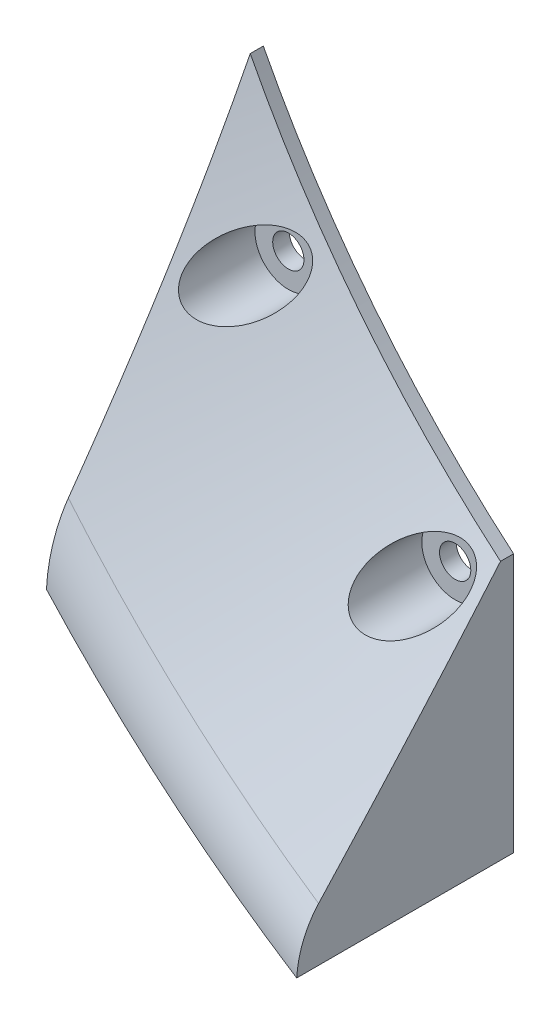
ISO-10303-21;
HEADER;
FILE_DESCRIPTION(('STEP AP214'),'2;1');
FILE_NAME('part.step','',(''),(''),'','','');
FILE_SCHEMA(('AUTOMOTIVE_DESIGN { 1 0 10303 214 1 1 1 1 }'));
ENDSEC;
DATA;
#1=APPLICATION_CONTEXT('core data for automotive mechanical design processes');
#2=APPLICATION_PROTOCOL_DEFINITION('international standard','automotive_design',2000,#1);
#3=PRODUCT_CONTEXT('',#1,'mechanical');
#4=PRODUCT('Part','Part','',(#3));
#5=PRODUCT_RELATED_PRODUCT_CATEGORY('part','',(#4));
#6=PRODUCT_DEFINITION_FORMATION('','',#4);
#7=PRODUCT_DEFINITION_CONTEXT('part definition',#1,'design');
#8=PRODUCT_DEFINITION('design','',#6,#7);
#9=PRODUCT_DEFINITION_SHAPE('','',#8);
#10=(LENGTH_UNIT() NAMED_UNIT(*) SI_UNIT(.MILLI.,.METRE.));
#11=(NAMED_UNIT(*) PLANE_ANGLE_UNIT() SI_UNIT($,.RADIAN.));
#12=(NAMED_UNIT(*) SI_UNIT($,.STERADIAN.) SOLID_ANGLE_UNIT());
#13=UNCERTAINTY_MEASURE_WITH_UNIT(LENGTH_MEASURE(1.E-05),#10,'distance_accuracy_value','');
#14=(GEOMETRIC_REPRESENTATION_CONTEXT(3) GLOBAL_UNCERTAINTY_ASSIGNED_CONTEXT((#13)) GLOBAL_UNIT_ASSIGNED_CONTEXT((#10,
#11,#12)) REPRESENTATION_CONTEXT('',''));
#15=CARTESIAN_POINT('',(0.,0.,0.));
#16=DIRECTION('',(0.,0.,1.));
#17=DIRECTION('',(1.,0.,0.));
#18=AXIS2_PLACEMENT_3D('',#15,#16,#17);
#19=CARTESIAN_POINT('',(-140.965544713,0.,3.175));
#20=DIRECTION('',(1.,0.,0.));
#21=DIRECTION('',(0.,0.,-1.));
#22=AXIS2_PLACEMENT_3D('',#19,#20,#21);
#23=PLANE('',#22);
#24=DIRECTION('',(0.,0.,-1.));
#25=VECTOR('',#24,1.);
#26=CARTESIAN_POINT('',(-140.965544713,-128.136510034288,36.195));
#27=LINE('',#26,#25);
#28=CARTESIAN_POINT('',(-140.965544713,-128.136510034288,36.195));
#29=VERTEX_POINT('',#28);
#30=CARTESIAN_POINT('',(-140.965544713,-128.136510034288,3.175));
#31=VERTEX_POINT('',#30);
#32=EDGE_CURVE('E137',#29,#31,#27,.T.);
#33=ORIENTED_EDGE('',*,*,#32,.F.);
#34=CARTESIAN_POINT('',(-140.965544713,-128.136510034288,36.195));
#35=CARTESIAN_POINT('',(-140.965544713,-127.823580349849,36.1796656996604));
#36=CARTESIAN_POINT('',(-140.965544713,-127.510971987033,36.1578071405204));
#37=CARTESIAN_POINT('',(-140.965544713,-126.886924794625,36.1010465623842));
#38=CARTESIAN_POINT('',(-140.965544713,-126.575486029674,36.0661438328688));
#39=CARTESIAN_POINT('',(-140.965544713,-125.9537996422,35.9832296915999));
#40=CARTESIAN_POINT('',(-140.965544713,-125.643555028566,35.9351956141636));
#41=CARTESIAN_POINT('',(-140.965544713,-125.025416067989,35.8259748325979));
#42=CARTESIAN_POINT('',(-140.965544713,-124.717521692796,35.7647882868191));
#43=CARTESIAN_POINT('',(-140.965544713,-123.814718625966,35.5649447435988));
#44=CARTESIAN_POINT('',(-140.965544713,-123.223773655474,35.4077496997964));
#45=CARTESIAN_POINT('',(-140.965544713,-122.05879493956,35.0414120669158));
#46=CARTESIAN_POINT('',(-140.965544713,-121.48474633384,34.8323167498205));
#47=CARTESIAN_POINT('',(-140.965544713,-120.371871269923,34.3641787371624));
#48=CARTESIAN_POINT('',(-140.965544713,-119.832547293404,34.1063388877265));
#49=CARTESIAN_POINT('',(-140.965544713,-119.043408380623,33.6752720243169));
#50=CARTESIAN_POINT('',(-140.965544713,-118.782022278019,33.5230508447224));
#51=CARTESIAN_POINT('',(-140.965544713,-118.268546544607,33.2032771525242));
#52=CARTESIAN_POINT('',(-140.965544713,-118.016464041156,33.0357132146166));
#53=CARTESIAN_POINT('',(-140.965544713,-117.769882618231,32.8601815378478));
#54=B_SPLINE_CURVE_WITH_KNOTS('',3,(#34,#35,#36,#37,#38,#39,#40,#41,#42,#43,#44,#45,#46,#47,#48,
#49,#50,#51,#52,#53),.UNSPECIFIED.,.F.,.F.,(4,2,2,2,2,2,2,2,2,4),(0.,0.939843409882723,
1.87973802073256,2.82126531601604,3.76278127629976,5.59477906008722,7.42511430144152,
9.21509548376389,10.1220648596623,11.0297152089648),.UNSPECIFIED.);
#55=CARTESIAN_POINT('',(-140.965544713,-117.769882618231,32.8601815378473));
#56=VERTEX_POINT('',#55);
#57=EDGE_CURVE('E79',#29,#56,#54,.T.);
#58=ORIENTED_EDGE('',*,*,#57,.T.);
#59=CARTESIAN_POINT('',(-140.965544713,-122.400454671408,36.195));
#60=CARTESIAN_POINT('',(-140.965544713,-121.416590849687,35.4785968685116));
#61=CARTESIAN_POINT('',(-140.965544713,-120.430388900259,34.76540874244));
#62=CARTESIAN_POINT('',(-140.965544713,-118.453117212918,33.3457993893004));
#63=CARTESIAN_POINT('',(-140.965544713,-117.462047442748,32.6393782071672));
#64=CARTESIAN_POINT('',(-140.965544713,-114.48118501242,30.5307253962073));
#65=CARTESIAN_POINT('',(-140.965544713,-112.483822098221,29.1391649220652));
#66=CARTESIAN_POINT('',(-140.965544713,-108.47048503121,26.3897295277692));
#67=CARTESIAN_POINT('',(-140.965544713,-106.454543729004,25.031806684119));
#68=CARTESIAN_POINT('',(-140.965544713,-102.399473321646,22.3509979809147));
#69=CARTESIAN_POINT('',(-140.965544713,-100.36034425642,21.0281120610459));
#70=CARTESIAN_POINT('',(-140.965544713,-96.2563588364718,18.4208440314967));
#71=CARTESIAN_POINT('',(-140.965544713,-94.1914918681593,17.1364786038629));
#72=CARTESIAN_POINT('',(-140.965544713,-90.0352609181289,14.6114798516549));
#73=CARTESIAN_POINT('',(-140.965544713,-87.9438978934333,13.3708449536465));
#74=CARTESIAN_POINT('',(-140.965544713,-83.7297219329408,10.9366392217588));
#75=CARTESIAN_POINT('',(-140.965544713,-81.6068668523711,9.7431411216564));
#76=CARTESIAN_POINT('',(-140.965544713,-78.3999695866644,7.99408029022117));
#77=CARTESIAN_POINT('',(-140.965544713,-77.3271526736967,7.41788235005025));
#78=CARTESIAN_POINT('',(-140.965544713,-75.1737936033442,6.280052268688));
#79=CARTESIAN_POINT('',(-140.965544713,-74.0932512736997,5.71842045358934));
#80=CARTESIAN_POINT('',(-140.965544713,-73.0087508711607,5.16448633567178));
#81=B_SPLINE_CURVE_WITH_KNOTS('',3,(#59,#60,#61,#62,#63,#64,#65,#66,#67,#68,#69,#70,#71,#72,#73,
#74,#75,#76,#77,#78,#79,#80),.UNSPECIFIED.,.F.,.F.,(4,2,2,2,2,2,2,2,2,2,4),(0.,3.65115060245099,
7.3023254330328,14.6049827275261,21.8965557206125,29.1881161606817,36.4827900453566,
43.7772011975581,51.0824600388428,54.7356424704663,58.3889066156202),.UNSPECIFIED.);
#82=CARTESIAN_POINT('',(-140.965544713,-73.0087508711607,5.16448633567178));
#83=VERTEX_POINT('',#82);
#84=EDGE_CURVE('E104',#56,#83,#81,.T.);
#85=ORIENTED_EDGE('',*,*,#84,.T.);
#86=DIRECTION('',(0.,0.,-1.));
#87=VECTOR('',#86,1.);
#88=CARTESIAN_POINT('',(-140.965544713,-73.0087508711607,36.195));
#89=LINE('',#88,#87);
#90=CARTESIAN_POINT('',(-140.965544713,-73.0087508711607,3.175));
#91=VERTEX_POINT('',#90);
#92=EDGE_CURVE('E100',#83,#91,#89,.T.);
#93=ORIENTED_EDGE('',*,*,#92,.T.);
#94=DIRECTION('',(0.,-1.,0.));
#95=VECTOR('',#94,1.);
#96=CARTESIAN_POINT('',(-140.965544713,0.,3.175));
#97=LINE('',#96,#95);
#98=EDGE_CURVE('E102',#91,#31,#97,.T.);
#99=ORIENTED_EDGE('',*,*,#98,.T.);
#100=EDGE_LOOP('',(#33,#58,#85,#93,#99));
#101=FACE_BOUND('',#100,.T.);
#102=ADVANCED_FACE('F51',(#101),#23,.F.);
#103=CARTESIAN_POINT('',(-102.865544713,0.,3.175));
#104=DIRECTION('',(1.,0.,0.));
#105=DIRECTION('',(0.,0.,-1.));
#106=AXIS2_PLACEMENT_3D('',#103,#104,#105);
#107=PLANE('',#106);
#108=CARTESIAN_POINT('',(-102.865544713,-120.914193587427,5.16448633567178));
#109=CARTESIAN_POINT('',(-102.865544713,-122.399563837253,6.42100901924889));
#110=CARTESIAN_POINT('',(-102.865544713,-123.880160902784,7.68316059880523));
#111=CARTESIAN_POINT('',(-102.865544713,-126.832432831344,10.2178324006914));
#112=CARTESIAN_POINT('',(-102.865544713,-128.304107770391,11.4903525344618));
#113=CARTESIAN_POINT('',(-102.865544713,-131.239001679849,14.0447342694597));
#114=CARTESIAN_POINT('',(-102.865544713,-132.702221683243,15.3265946843371));
#115=CARTESIAN_POINT('',(-102.865544713,-135.62095552979,17.8990597877047));
#116=CARTESIAN_POINT('',(-102.865544713,-137.07646935619,19.1896644951896));
#117=CARTESIAN_POINT('',(-102.865544713,-141.432155458038,23.0734602819268));
#118=CARTESIAN_POINT('',(-102.865544713,-144.32157637017,25.6787237219854));
#119=CARTESIAN_POINT('',(-102.865544713,-148.63709536136,29.607381891577));
#120=CARTESIAN_POINT('',(-102.865544713,-150.072592689782,30.9204814755747));
#121=CARTESIAN_POINT('',(-102.865544713,-152.937709400675,33.553067705367));
#122=CARTESIAN_POINT('',(-102.865544713,-154.367328805098,34.8725543272694));
#123=CARTESIAN_POINT('',(-102.865544713,-155.794209811847,36.195));
#124=B_SPLINE_CURVE_WITH_KNOTS('',3,(#108,#109,#110,#111,#112,#113,#114,#115,#116,#117,#118,
#119,#120,#121,#122,#123),.UNSPECIFIED.,.F.,.F.,(4,2,2,2,2,2,2,4),(0.,5.83663014040787,
11.6732104813489,17.509061984713,23.3449261690225,35.0162405528466,40.8526594638885,
46.6890565592332),.UNSPECIFIED.);
#125=CARTESIAN_POINT('',(-102.865544713,-120.914193587427,5.16448633567178));
#126=VERTEX_POINT('',#125);
#127=CARTESIAN_POINT('',(-102.865544713,-152.183145449951,32.8601815378427));
#128=VERTEX_POINT('',#127);
#129=EDGE_CURVE('E128',#126,#128,#124,.T.);
#130=ORIENTED_EDGE('',*,*,#129,.T.);
#131=CARTESIAN_POINT('',(-102.865544713,-152.183145449951,32.8601815378427));
#132=CARTESIAN_POINT('',(-102.865544713,-152.443121718155,33.0993914461446));
#133=CARTESIAN_POINT('',(-102.865544713,-152.714270381032,33.3262228842414));
#134=CARTESIAN_POINT('',(-102.865544713,-153.275554277137,33.7545493000897));
#135=CARTESIAN_POINT('',(-102.865544713,-153.565673176992,33.9560656485142));
#136=CARTESIAN_POINT('',(-102.865544713,-154.161490290658,34.3332727800575));
#137=CARTESIAN_POINT('',(-102.865544713,-154.46716147505,34.5090064380888));
#138=CARTESIAN_POINT('',(-102.865544713,-155.091846918515,34.8349149125472));
#139=CARTESIAN_POINT('',(-102.865544713,-155.410862389247,34.9850874017217));
#140=CARTESIAN_POINT('',(-102.865544713,-156.058624801755,35.2593065570738));
#141=CARTESIAN_POINT('',(-102.865544713,-156.387334980607,35.3834402899615));
#142=CARTESIAN_POINT('',(-102.865544713,-157.053285929378,35.6061906027648));
#143=CARTESIAN_POINT('',(-102.865544713,-157.390526937879,35.7048064681522));
#144=CARTESIAN_POINT('',(-102.865544713,-158.070962609656,35.8763613762573));
#145=CARTESIAN_POINT('',(-102.865544713,-158.414148391961,35.9493357488788));
#146=CARTESIAN_POINT('',(-102.865544713,-159.104970758979,36.0697426777758));
#147=CARTESIAN_POINT('',(-102.865544713,-159.45260708813,36.1171766939584));
#148=CARTESIAN_POINT('',(-102.865544713,-159.98071516167,36.1695822058618));
#149=CARTESIAN_POINT('',(-102.865544713,-160.160286783164,36.183986081665));
#150=CARTESIAN_POINT('',(-102.865544713,-160.340044003043,36.1950000000002));
#151=B_SPLINE_CURVE_WITH_KNOTS('',3,(#131,#132,#133,#134,#135,#136,#137,#138,#139,#140,#141,
#142,#143,#144,#145,#146,#147,#148,#149,#150),.UNSPECIFIED.,.F.,.F.,(4,2,2,2,2,2,2,2,2,4),(0.,
1.05922674855689,2.11755321519276,3.17409930626109,4.23074154065711,5.28379224764771,
6.3368724380152,7.38849590842379,8.44005926081059,8.98036703986255),.UNSPECIFIED.);
#152=CARTESIAN_POINT('',(-102.865544713,-160.340044003043,36.195));
#153=VERTEX_POINT('',#152);
#154=EDGE_CURVE('E13',#128,#153,#151,.T.);
#155=ORIENTED_EDGE('',*,*,#154,.T.);
#156=DIRECTION('',(0.,0.,-1.));
#157=VECTOR('',#156,1.);
#158=CARTESIAN_POINT('',(-102.865544713,-160.340044003043,36.195));
#159=LINE('',#158,#157);
#160=CARTESIAN_POINT('',(-102.865544713,-160.340044003043,3.175));
#161=VERTEX_POINT('',#160);
#162=EDGE_CURVE('E119',#153,#161,#159,.T.);
#163=ORIENTED_EDGE('',*,*,#162,.T.);
#164=DIRECTION('',(0.,-1.,0.));
#165=VECTOR('',#164,1.);
#166=CARTESIAN_POINT('',(-102.865544713,0.,3.175));
#167=LINE('',#166,#165);
#168=CARTESIAN_POINT('',(-102.865544713,-120.914193587427,3.175));
#169=VERTEX_POINT('',#168);
#170=EDGE_CURVE('E134',#169,#161,#167,.T.);
#171=ORIENTED_EDGE('',*,*,#170,.F.);
#172=DIRECTION('',(0.,0.,-1.));
#173=VECTOR('',#172,1.);
#174=CARTESIAN_POINT('',(-102.865544713,-120.914193587427,36.195));
#175=LINE('',#174,#173);
#176=EDGE_CURVE('E123',#126,#169,#175,.T.);
#177=ORIENTED_EDGE('',*,*,#176,.F.);
#178=EDGE_LOOP('',(#130,#155,#163,#171,#177));
#179=FACE_BOUND('',#178,.T.);
#180=ADVANCED_FACE('F155',(#179),#107,.T.);
#181=CARTESIAN_POINT('',(-134.615544713,-95.5859044086643,0.));
#182=DIRECTION('',(0.,0.,1.));
#183=DIRECTION('',(1.,0.,0.));
#184=AXIS2_PLACEMENT_3D('',#181,#182,#183);
#185=CYLINDRICAL_SURFACE('',#184,2.38125);
#186=CARTESIAN_POINT('',(-134.615544713,-95.5859044086643,5.715));
#187=DIRECTION('',(0.,0.,-1.));
#188=DIRECTION('',(-1.,0.,0.));
#189=AXIS2_PLACEMENT_3D('',#186,#187,#188);
#190=CIRCLE('',#189,2.38125);
#191=CARTESIAN_POINT('',(-136.996794713,-95.5859044086643,5.715));
#192=VERTEX_POINT('',#191);
#193=EDGE_CURVE('E109',#192,#192,#190,.F.);
#194=ORIENTED_EDGE('',*,*,#193,.T.);
#195=EDGE_LOOP('',(#194));
#196=FACE_BOUND('',#195,.T.);
#197=CARTESIAN_POINT('',(-134.615544713,-95.5859044086643,3.175));
#198=DIRECTION('',(0.,0.,1.));
#199=DIRECTION('',(1.,0.,0.));
#200=AXIS2_PLACEMENT_3D('',#197,#198,#199);
#201=CIRCLE('',#200,2.38125);
#202=CARTESIAN_POINT('',(-132.234294713,-95.5859044086643,3.175));
#203=VERTEX_POINT('',#202);
#204=EDGE_CURVE('E139',#203,#203,#201,.F.);
#205=ORIENTED_EDGE('',*,*,#204,.T.);
#206=EDGE_LOOP('',(#205));
#207=FACE_BOUND('',#206,.T.);
#208=ADVANCED_FACE('F199',(#196,#207),#185,.F.);
#209=CARTESIAN_POINT('',(-109.215544713,-123.814275400871,0.));
#210=DIRECTION('',(0.,0.,1.));
#211=DIRECTION('',(1.,0.,0.));
#212=AXIS2_PLACEMENT_3D('',#209,#210,#211);
#213=CYLINDRICAL_SURFACE('',#212,2.38125);
#214=CARTESIAN_POINT('',(-109.215544713,-123.814275400871,5.715));
#215=DIRECTION('',(0.,0.,-1.));
#216=DIRECTION('',(-1.,0.,0.));
#217=AXIS2_PLACEMENT_3D('',#214,#215,#216);
#218=CIRCLE('',#217,2.38125);
#219=CARTESIAN_POINT('',(-111.596794713,-123.814275400871,5.715));
#220=VERTEX_POINT('',#219);
#221=EDGE_CURVE('E224',#220,#220,#218,.F.);
#222=ORIENTED_EDGE('',*,*,#221,.T.);
#223=EDGE_LOOP('',(#222));
#224=FACE_BOUND('',#223,.T.);
#225=CARTESIAN_POINT('',(-109.215544713,-123.814275400871,3.175));
#226=DIRECTION('',(0.,0.,1.));
#227=DIRECTION('',(1.,0.,0.));
#228=AXIS2_PLACEMENT_3D('',#225,#226,#227);
#229=CIRCLE('',#228,2.38125);
#230=CARTESIAN_POINT('',(-106.834294713,-123.814275400871,3.175));
#231=VERTEX_POINT('',#230);
#232=EDGE_CURVE('E136',#231,#231,#229,.F.);
#233=ORIENTED_EDGE('',*,*,#232,.T.);
#234=EDGE_LOOP('',(#233));
#235=FACE_BOUND('',#234,.T.);
#236=ADVANCED_FACE('F197',(#224,#235),#213,.F.);
#237=CARTESIAN_POINT('',(0.,0.,3.175));
#238=DIRECTION('',(0.,0.,1.));
#239=DIRECTION('',(1.,0.,0.));
#240=AXIS2_PLACEMENT_3D('',#237,#238,#239);
#241=PLANE('',#240);
#242=CARTESIAN_POINT('',(0.,0.,3.175));
#243=DIRECTION('',(0.,0.,1.));
#244=DIRECTION('',(1.,0.,0.));
#245=AXIS2_PLACEMENT_3D('',#242,#243,#244);
#246=CIRCLE('',#245,190.5);
#247=EDGE_CURVE('E117',#31,#161,#246,.T.);
#248=ORIENTED_EDGE('',*,*,#247,.F.);
#249=ORIENTED_EDGE('',*,*,#98,.F.);
#250=CARTESIAN_POINT('',(0.,0.,3.175));
#251=DIRECTION('',(0.,0.,1.));
#252=DIRECTION('',(1.,0.,0.));
#253=AXIS2_PLACEMENT_3D('',#250,#251,#252);
#254=CIRCLE('',#253,158.75);
#255=EDGE_CURVE('E115',#91,#169,#254,.T.);
#256=ORIENTED_EDGE('',*,*,#255,.T.);
#257=ORIENTED_EDGE('',*,*,#170,.T.);
#258=EDGE_LOOP('',(#248,#249,#256,#257));
#259=FACE_BOUND('',#258,.T.);
#260=ORIENTED_EDGE('',*,*,#232,.F.);
#261=EDGE_LOOP('',(#260));
#262=FACE_BOUND('',#261,.T.);
#263=ORIENTED_EDGE('',*,*,#204,.F.);
#264=EDGE_LOOP('',(#263));
#265=FACE_BOUND('',#264,.T.);
#266=ADVANCED_FACE('F113',(#259,#262,#265),#241,.F.);
#267=CARTESIAN_POINT('',(0.,0.,36.195));
#268=DIRECTION('',(0.,0.,-1.));
#269=DIRECTION('',(-1.,0.,0.));
#270=AXIS2_PLACEMENT_3D('',#267,#268,#269);
#271=CYLINDRICAL_SURFACE('',#270,190.5);
#272=ORIENTED_EDGE('',*,*,#247,.T.);
#273=ORIENTED_EDGE('',*,*,#162,.F.);
#274=CARTESIAN_POINT('',(0.,0.,36.195));
#275=DIRECTION('',(0.,0.,1.));
#276=DIRECTION('',(1.,0.,0.));
#277=AXIS2_PLACEMENT_3D('',#274,#275,#276);
#278=CIRCLE('',#277,190.5);
#279=EDGE_CURVE('E126',#29,#153,#278,.T.);
#280=ORIENTED_EDGE('',*,*,#279,.F.);
#281=ORIENTED_EDGE('',*,*,#32,.T.);
#282=EDGE_LOOP('',(#272,#273,#280,#281));
#283=FACE_BOUND('',#282,.T.);
#284=ADVANCED_FACE('F216',(#283),#271,.T.);
#285=CARTESIAN_POINT('',(0.,0.,36.195));
#286=DIRECTION('',(0.,0.,-1.));
#287=DIRECTION('',(-1.,0.,0.));
#288=AXIS2_PLACEMENT_3D('',#285,#286,#287);
#289=CYLINDRICAL_SURFACE('',#288,158.75);
#290=ORIENTED_EDGE('',*,*,#92,.F.);
#291=CARTESIAN_POINT('',(0.,0.,5.16448633567178));
#292=DIRECTION('',(0.,0.,1.));
#293=DIRECTION('',(1.,0.,0.));
#294=AXIS2_PLACEMENT_3D('',#291,#292,#293);
#295=CIRCLE('',#294,158.75);
#296=EDGE_CURVE('E125',#83,#126,#295,.T.);
#297=ORIENTED_EDGE('',*,*,#296,.T.);
#298=ORIENTED_EDGE('',*,*,#176,.T.);
#299=ORIENTED_EDGE('',*,*,#255,.F.);
#300=EDGE_LOOP('',(#290,#297,#298,#299));
#301=FACE_BOUND('',#300,.T.);
#302=ADVANCED_FACE('F121',(#301),#289,.F.);
#303=CARTESIAN_POINT('',(0.,0.,5.16448633567178));
#304=DIRECTION('',(0.,0.,1.));
#305=DIRECTION('',(1.,0.,0.));
#306=AXIS2_PLACEMENT_3D('',#303,#304,#305);
#307=CONICAL_SURFACE('',#306,158.75,0.733038285837613);
#308=CARTESIAN_POINT('',(-113.140586966999,-127.039247230876,17.7887178190615));
#309=CARTESIAN_POINT('',(-113.076390315873,-127.11738039782,17.8061015104382));
#310=CARTESIAN_POINT('',(-113.009518090225,-127.194005570302,17.8203561981865));
#311=CARTESIAN_POINT('',(-112.870758813036,-127.343612167539,17.8423442933654));
#312=CARTESIAN_POINT('',(-112.798870499912,-127.416592667658,17.8500760537861));
#313=CARTESIAN_POINT('',(-112.650562829045,-127.558280265856,17.8588567655701));
#314=CARTESIAN_POINT('',(-112.574141848034,-127.626985814693,17.859903308018));
#315=CARTESIAN_POINT('',(-112.4173609923,-127.759565749781,17.8552852893378));
#316=CARTESIAN_POINT('',(-112.336999599818,-127.823438249972,17.8496181224601));
#317=CARTESIAN_POINT('',(-112.173243563226,-127.945720016927,17.831705659719));
#318=CARTESIAN_POINT('',(-112.089856980553,-128.004142506699,17.8194767985287));
#319=CARTESIAN_POINT('',(-111.92052943578,-128.115406180831,17.7886831431106));
#320=CARTESIAN_POINT('',(-111.834587494397,-128.168245189183,17.770115890508));
#321=CARTESIAN_POINT('',(-111.660864408019,-128.268133534975,17.7269815073936));
#322=CARTESIAN_POINT('',(-111.573083125788,-128.315182438599,17.7024139277266));
#323=CARTESIAN_POINT('',(-111.396326247801,-128.403431732317,17.6476845160489));
#324=CARTESIAN_POINT('',(-111.307350409542,-128.444630914614,17.6175215317062));
#325=CARTESIAN_POINT('',(-111.106927829961,-128.530596831443,17.5440259651274));
#326=CARTESIAN_POINT('',(-110.995312742537,-128.573767585892,17.4992770794999));
#327=CARTESIAN_POINT('',(-110.772130697494,-128.651362913875,17.4026941886754));
#328=CARTESIAN_POINT('',(-110.66056375641,-128.685785512373,17.3508585875962));
#329=CARTESIAN_POINT('',(-110.326916638053,-128.776571152282,17.1859166525368));
#330=CARTESIAN_POINT('',(-110.106005774244,-128.820403901592,17.0634187224647));
#331=CARTESIAN_POINT('',(-109.58783700381,-128.889730781329,16.7485647750944));
#332=CARTESIAN_POINT('',(-109.294104985017,-128.901570484311,16.5475165368222));
#333=CARTESIAN_POINT('',(-108.86897346313,-128.884429292071,16.2280782326074));
#334=CARTESIAN_POINT('',(-108.729670549546,-128.872861111811,16.1184677221754));
#335=CARTESIAN_POINT('',(-108.456422181706,-128.839120813814,15.8942485653298));
#336=CARTESIAN_POINT('',(-108.322476768947,-128.816948613957,15.7796398802156));
#337=CARTESIAN_POINT('',(-108.002550679183,-128.751098223893,15.4950973422487));
#338=CARTESIAN_POINT('',(-107.819571266756,-128.702251005113,15.3229844231208));
#339=CARTESIAN_POINT('',(-107.465537902478,-128.586962725597,14.972462926533));
#340=CARTESIAN_POINT('',(-107.294489126722,-128.520514087749,14.7940516664811));
#341=CARTESIAN_POINT('',(-106.964442393956,-128.371874926291,14.4324976689105));
#342=CARTESIAN_POINT('',(-106.805452857004,-128.28967354241,14.2493517430152));
#343=CARTESIAN_POINT('',(-106.499821695643,-128.111084614674,13.8797893209877));
#344=CARTESIAN_POINT('',(-106.353178566457,-128.01469880356,13.6933732267792));
#345=CARTESIAN_POINT('',(-106.067878428309,-127.80562478509,13.3123117388358));
#346=CARTESIAN_POINT('',(-105.929629112499,-127.692512450487,13.1175943203596));
#347=CARTESIAN_POINT('',(-105.666717166591,-127.453477151525,12.7268510746178));
#348=CARTESIAN_POINT('',(-105.542055321659,-127.327553447662,12.5308251724343));
#349=CARTESIAN_POINT('',(-105.306710767366,-127.063687115915,12.1384026626774));
#350=CARTESIAN_POINT('',(-105.196030870695,-126.925742079152,11.9420059885568));
#351=CARTESIAN_POINT('',(-104.989259965623,-126.638497866944,11.5498456510513));
#352=CARTESIAN_POINT('',(-104.893168347585,-126.489199166354,11.354081961549));
#353=CARTESIAN_POINT('',(-104.715645465079,-126.178503852977,10.9626265988547));
#354=CARTESIAN_POINT('',(-104.63433758184,-126.017020042858,10.766948020491));
#355=CARTESIAN_POINT('',(-104.488397056295,-125.683401476994,10.3783770230577));
#356=CARTESIAN_POINT('',(-104.423767092489,-125.511265015915,10.1854850562121));
#357=CARTESIAN_POINT('',(-104.312674978481,-125.15692600972,9.80412135998445));
#358=CARTESIAN_POINT('',(-104.266193190243,-124.974734590134,9.61564506126811));
#359=CARTESIAN_POINT('',(-104.193147299341,-124.60056302436,9.24469893467824));
#360=CARTESIAN_POINT('',(-104.166573387411,-124.40858774887,9.06222619108834));
#361=CARTESIAN_POINT('',(-104.141220382312,-124.085687081535,8.76933618015192));
#362=CARTESIAN_POINT('',(-104.135900565051,-123.957475363168,8.65648281768621));
#363=CARTESIAN_POINT('',(-104.135223099943,-123.697452302531,8.4349806756223));
#364=CARTESIAN_POINT('',(-104.139867054039,-123.565640384798,8.326332574991));
#365=CARTESIAN_POINT('',(-104.17005078967,-123.16552045803,8.00832029168472));
#366=CARTESIAN_POINT('',(-104.21179356449,-122.891996178434,7.80639996191763));
#367=CARTESIAN_POINT('',(-104.329918771818,-122.406111854473,7.48032423245789));
#368=CARTESIAN_POINT('',(-104.395007782082,-122.195589541588,7.3493579295817));
#369=CARTESIAN_POINT('',(-104.557938752848,-121.773670652553,7.11117175586325));
#370=CARTESIAN_POINT('',(-104.655732978925,-121.562275791478,7.003917653008));
#371=CARTESIAN_POINT('',(-104.863589631382,-121.18689499686,6.83921220646396));
#372=CARTESIAN_POINT('',(-104.967246021531,-121.021912530993,6.77608509386644));
#373=CARTESIAN_POINT('',(-105.139481168932,-120.780811235291,6.69951983513149));
#374=CARTESIAN_POINT('',(-105.19969694184,-120.70149255677,6.67701657571878));
#375=CARTESIAN_POINT('',(-105.325513429326,-120.545626087158,6.63846379467833));
#376=CARTESIAN_POINT('',(-105.391111901059,-120.469077160943,6.6224116013199));
#377=CARTESIAN_POINT('',(-105.527745463243,-120.31900802809,6.59702703452759));
#378=CARTESIAN_POINT('',(-105.598808980202,-120.245507214774,6.58773285214586));
#379=CARTESIAN_POINT('',(-105.745518939006,-120.102699409142,6.57622160369489));
#380=CARTESIAN_POINT('',(-105.821163491948,-120.033390711533,6.57400164068308));
#381=CARTESIAN_POINT('',(-105.976459868918,-119.899529644222,6.57668667954218));
#382=CARTESIAN_POINT('',(-106.056112414079,-119.834978135638,6.58159296805272));
#383=CARTESIAN_POINT('',(-106.21867409863,-119.711151343348,6.59840643227028));
#384=CARTESIAN_POINT('',(-106.301583137189,-119.65187589646,6.61031339137008));
#385=CARTESIAN_POINT('',(-106.540999415747,-119.491311282885,6.6538024895316));
#386=CARTESIAN_POINT('',(-106.70063799021,-119.39672221954,6.69350918055355));
#387=CARTESIAN_POINT('',(-107.023960721251,-119.227688131059,6.79323937307681));
#388=CARTESIAN_POINT('',(-107.187646451854,-119.153251082363,6.85327089832455));
#389=CARTESIAN_POINT('',(-107.581195174189,-118.998038809066,7.01788342203895));
#390=CARTESIAN_POINT('',(-107.811326581218,-118.926648732332,7.13067847838025));
#391=CARTESIAN_POINT('',(-108.266067224069,-118.818293516656,7.38130155358936));
#392=CARTESIAN_POINT('',(-108.490663402482,-118.781403366094,7.51918332758338));
#393=CARTESIAN_POINT('',(-108.868878279669,-118.743622083132,7.77185521356254));
#394=CARTESIAN_POINT('',(-109.024781511631,-118.735548795046,7.88232001342649));
#395=CARTESIAN_POINT('',(-109.33115491127,-118.733279961618,8.11077579873637));
#396=CARTESIAN_POINT('',(-109.481622727555,-118.739090351146,8.22876998179223));
#397=CARTESIAN_POINT('',(-109.776833030452,-118.763204232285,8.47084556459911));
#398=CARTESIAN_POINT('',(-109.921567235139,-118.781525145087,8.59493522853087));
#399=CARTESIAN_POINT('',(-110.204864869405,-118.82947040586,8.84782312489465));
#400=CARTESIAN_POINT('',(-110.343428384754,-118.859094596666,8.97662129183519));
#401=CARTESIAN_POINT('',(-110.674409085893,-118.944070825663,9.29597839132338));
#402=CARTESIAN_POINT('',(-110.863436981019,-119.005006162067,9.48858016123775));
#403=CARTESIAN_POINT('',(-111.228233765604,-119.145900185466,9.8793370938676));
#404=CARTESIAN_POINT('',(-111.403996915455,-119.225867045877,10.0774946102485));
#405=CARTESIAN_POINT('',(-111.742171264376,-119.403037520644,10.4777417892231));
#406=CARTESIAN_POINT('',(-111.904571224761,-119.500255430895,10.6798345883567));
#407=CARTESIAN_POINT('',(-112.215575388584,-119.710443606866,11.0863440868811));
#408=CARTESIAN_POINT('',(-112.364181433658,-119.823411764705,11.2907604719459));
#409=CARTESIAN_POINT('',(-112.651050457004,-120.067265108108,11.7062546234733));
#410=CARTESIAN_POINT('',(-112.788927714348,-120.198550490753,11.9173636729047));
#411=CARTESIAN_POINT('',(-113.049157588357,-120.475720184138,12.3396047955641));
#412=CARTESIAN_POINT('',(-113.171508605866,-120.621605995914,12.5507368689258));
#413=CARTESIAN_POINT('',(-113.399759282327,-120.927216636812,12.9717180739997));
#414=CARTESIAN_POINT('',(-113.505666063605,-121.086935427637,13.1815677231094));
#415=CARTESIAN_POINT('',(-113.69991628387,-121.419713972098,13.5987772615913));
#416=CARTESIAN_POINT('',(-113.788263298855,-121.592770999455,13.806137649796));
#417=CARTESIAN_POINT('',(-113.931680624795,-121.919467197334,14.1799465013823));
#418=CARTESIAN_POINT('',(-113.989878220293,-122.070996825346,14.3470424368463));
#419=CARTESIAN_POINT('',(-114.092359560558,-122.382505089657,14.677646188619));
#420=CARTESIAN_POINT('',(-114.136642651981,-122.542484122278,14.8411538361074));
#421=CARTESIAN_POINT('',(-114.209911216409,-122.870403137607,15.1632102240033));
#422=CARTESIAN_POINT('',(-114.238914728231,-123.038333476587,15.3217646030864));
#423=CARTESIAN_POINT('',(-114.280058102995,-123.381826491086,15.6325568970638));
#424=CARTESIAN_POINT('',(-114.292204599656,-123.55738613619,15.7847972738048));
#425=CARTESIAN_POINT('',(-114.298723384778,-123.982789189361,16.1367653824529));
#426=CARTESIAN_POINT('',(-114.284737153336,-124.235832712287,16.3329290182894));
#427=CARTESIAN_POINT('',(-114.214978125778,-124.752267148071,16.7031256956984));
#428=CARTESIAN_POINT('',(-114.159255040327,-125.015645398404,16.8771847766807));
#429=CARTESIAN_POINT('',(-114.019065395651,-125.480311259046,17.1539320868535));
#430=CARTESIAN_POINT('',(-113.945318998887,-125.680596781037,17.2635699303579));
#431=CARTESIAN_POINT('',(-113.812387346098,-125.979294581189,17.4105646494451));
#432=CARTESIAN_POINT('',(-113.764406863927,-126.078490995751,17.4566217382474));
#433=CARTESIAN_POINT('',(-113.660808245722,-126.275660635477,17.5422624015761));
#434=CARTESIAN_POINT('',(-113.605193531984,-126.373634387389,17.5818488594525));
#435=CARTESIAN_POINT('',(-113.485923275877,-126.568062953143,17.6540339023377));
#436=CARTESIAN_POINT('',(-113.422225462053,-126.6645065436,17.6865931269762));
#437=CARTESIAN_POINT('',(-113.287103769617,-126.854404664638,17.7437707368517));
#438=CARTESIAN_POINT('',(-113.21567562053,-126.947857505725,17.7683847026763));
#439=CARTESIAN_POINT('',(-113.140586966999,-127.039247230876,17.7887178190615));
#440=B_SPLINE_CURVE_WITH_KNOTS('',3,(#308,#309,#310,#311,#312,#313,#314,#315,#316,#317,#318,
#319,#320,#321,#322,#323,#324,#325,#326,#327,#328,#329,#330,#331,#332,#333,#334,#335,#336,#337,
#338,#339,#340,#341,#342,#343,#344,#345,#346,#347,#348,#349,#350,#351,#352,#353,#354,#355,#356,
#357,#358,#359,#360,#361,#362,#363,#364,#365,#366,#367,#368,#369,#370,#371,#372,#373,#374,#375,
#376,#377,#378,#379,#380,#381,#382,#383,#384,#385,#386,#387,#388,#389,#390,#391,#392,#393,#394,
#395,#396,#397,#398,#399,#400,#401,#402,#403,#404,#405,#406,#407,#408,#409,#410,#411,#412,#413,
#414,#415,#416,#417,#418,#419,#420,#421,#422,#423,#424,#425,#426,#427,#428,#429,#430,#431,#432,
#433,#434,#435,#436,#437,#438,#439),.UNSPECIFIED.,.T.,.F.,(4,2,2,2,2,2,2,2,2,2,2,2,2,2,2,2,2,2,
2,2,2,2,2,2,2,2,2,2,2,2,2,2,2,2,2,2,2,2,2,2,2,2,2,2,2,2,2,2,2,2,2,2,2,2,2,2,2,2,2,2,2,2,2,2,2,
4),(0.,0.30771368946044,0.615505052006561,0.923407316179262,1.23142912367335,1.53868302460266,
1.84605623104651,2.15345245300306,2.46091205135506,2.84364464431748,3.22646356858191,
3.99249399373615,5.05486964695786,5.58743721513727,6.12000890769639,6.88662829923126,
7.65357824530168,8.42105885728049,9.18844579307419,9.98047626261446,10.7725524761356,
11.5647877753237,12.3569899582534,13.155527241698,13.9541926916836,14.7519914990772,
15.5493969457114,16.0616947222102,16.57407487039,17.5966811956328,18.3631832045696,
19.1285713238863,19.7402775898132,20.0462404365667,20.3520764368696,20.6596276304391,
20.9670528634369,21.2745336087412,21.5820048408076,22.1486405159965,22.7155001463992,
23.5092153523691,24.3046517800034,24.8776448191043,25.450882840002,26.0249207402982,
26.5989506592242,27.427720905371,28.2568477255513,29.086664877213,29.9163710795461,
30.7683945512818,31.6205057077064,32.4722467620919,33.323814183628,34.0221449728915,
34.7205085468164,35.4180457862403,36.1153084468702,37.0736578231811,38.0308675693009,
38.7479030674051,39.10583087015,39.4635987408392,39.8233212993231,40.1832436038275),.UNSPECIFIED.);
#441=CARTESIAN_POINT('',(-113.140586966999,-127.039247230876,17.7887178190615));
#442=VERTEX_POINT('',#441);
#443=EDGE_CURVE('E178',#442,#442,#440,.T.);
#444=ORIENTED_EDGE('',*,*,#443,.F.);
#445=EDGE_LOOP('',(#444));
#446=FACE_BOUND('',#445,.T.);
#447=CARTESIAN_POINT('',(-134.690058522348,-100.66535789228,15.6059072257644));
#448=CARTESIAN_POINT('',(-134.493175847314,-100.668246167388,15.4326797190692));
#449=CARTESIAN_POINT('',(-134.299925571954,-100.659653517566,15.2551915531096));
#450=CARTESIAN_POINT('',(-133.921459157684,-100.621858383365,14.893802764287));
#451=CARTESIAN_POINT('',(-133.736248415869,-100.592642274436,14.7098979787776));
#452=CARTESIAN_POINT('',(-133.374125898444,-100.515371436444,14.3369858006296));
#453=CARTESIAN_POINT('',(-133.19723803548,-100.467265744322,14.1479659030821));
#454=CARTESIAN_POINT('',(-132.852846100262,-100.353729844209,13.7667185077645));
#455=CARTESIAN_POINT('',(-132.685340254457,-100.288302924061,13.5744916252124));
#456=CARTESIAN_POINT('',(-132.357477391858,-100.140070488582,13.1847582891658));
#457=CARTESIAN_POINT('',(-132.197283496901,-100.056996564263,12.9872170200292));
#458=CARTESIAN_POINT('',(-131.887581168339,-99.8750617193658,12.5910200225896));
#459=CARTESIAN_POINT('',(-131.738073470858,-99.7761997127345,12.3923642185261));
#460=CARTESIAN_POINT('',(-131.450447535462,-99.5634097203724,11.9950318245066));
#461=CARTESIAN_POINT('',(-131.312324454867,-99.4494881947726,11.7963552797594));
#462=CARTESIAN_POINT('',(-131.048174375993,-99.2070106544826,11.3999048208961));
#463=CARTESIAN_POINT('',(-130.922146582457,-99.0784556031524,11.2021308482522));
#464=CARTESIAN_POINT('',(-130.686321308347,-98.8105895479875,10.8137769126497));
#465=CARTESIAN_POINT('',(-130.576181547605,-98.6716551072164,10.6231454304942));
#466=CARTESIAN_POINT('',(-130.369383655291,-98.3802632626502,10.2448376702434));
#467=CARTESIAN_POINT('',(-130.272727448525,-98.2278039332198,10.0571618174557));
#468=CARTESIAN_POINT('',(-130.094451697655,-97.9095556668038,9.68634925986457));
#469=CARTESIAN_POINT('',(-130.012816929664,-97.7437804727339,9.50320812401504));
#470=CARTESIAN_POINT('',(-129.866332897003,-97.3987745885825,9.14303776442716));
#471=CARTESIAN_POINT('',(-129.80147553198,-97.2195504459592,8.9660056270971));
#472=CARTESIAN_POINT('',(-129.710521064044,-96.913607602748,8.6816115631344));
#473=CARTESIAN_POINT('',(-129.678835272589,-96.7908110649881,8.57180835760004));
#474=CARTESIAN_POINT('',(-129.624225667031,-96.5396664110092,8.35646434294883));
#475=CARTESIAN_POINT('',(-129.601303262117,-96.4113174056214,8.25092422179167));
#476=CARTESIAN_POINT('',(-129.547089597617,-96.0183601293182,7.94231098685605));
#477=CARTESIAN_POINT('',(-129.530194109943,-95.7453355107561,7.74676759685844));
#478=CARTESIAN_POINT('',(-129.542172537128,-95.2507256080322,7.43158988077237));
#479=CARTESIAN_POINT('',(-129.560713534856,-95.033223295291,7.30516885211168));
#480=CARTESIAN_POINT('',(-129.628997630121,-94.5905793321138,7.07610501258629));
#481=CARTESIAN_POINT('',(-129.678695876403,-94.3654491020774,6.9734283117932));
#482=CARTESIAN_POINT('',(-129.799920421721,-93.9573308591555,6.81621369025177));
#483=CARTESIAN_POINT('',(-129.865326753801,-93.7746566444962,6.75619819669269));
#484=CARTESIAN_POINT('',(-130.019593335655,-93.4128430873907,6.66036975721741));
#485=CARTESIAN_POINT('',(-130.108435505387,-93.2337011339219,6.62453822960676));
#486=CARTESIAN_POINT('',(-130.30899740715,-92.8838956362606,6.57986449303516));
#487=CARTESIAN_POINT('',(-130.420820514235,-92.7132748917344,6.57114721563324));
#488=CARTESIAN_POINT('',(-130.663734202355,-92.3873254602811,6.58186168796253));
#489=CARTESIAN_POINT('',(-130.794825584434,-92.2319974095677,6.60129460828297));
#490=CARTESIAN_POINT('',(-131.06165721014,-91.9511805848456,6.66427584442706));
#491=CARTESIAN_POINT('',(-131.196440335963,-91.8243679597352,6.70605331569617));
#492=CARTESIAN_POINT('',(-131.474237210373,-91.5894387944786,6.80963618926423));
#493=CARTESIAN_POINT('',(-131.617254209847,-91.4813297072428,6.87144954731945));
#494=CARTESIAN_POINT('',(-131.968697406175,-91.2427935252597,7.04120283418359));
#495=CARTESIAN_POINT('',(-132.179492130164,-91.1219066590289,7.15762502634609));
#496=CARTESIAN_POINT('',(-132.603173605459,-90.9155095821175,7.4155095129443));
#497=CARTESIAN_POINT('',(-132.816063968256,-90.8300786921877,7.55702695154486));
#498=CARTESIAN_POINT('',(-133.180339186531,-90.7102066166072,7.81619162245011));
#499=CARTESIAN_POINT('',(-133.332394313541,-90.6681942725124,7.92956161801081));
#500=CARTESIAN_POINT('',(-133.634191158244,-90.5991901875735,8.16381064972571));
#501=CARTESIAN_POINT('',(-133.783931849336,-90.5722049362725,8.28469290508493));
#502=CARTESIAN_POINT('',(-134.080505076295,-90.5319397533347,8.53251041513967));
#503=CARTESIAN_POINT('',(-134.22733333811,-90.5186786853048,8.65945375078664));
#504=CARTESIAN_POINT('',(-134.517383080937,-90.5047784777627,8.91800338115941));
#505=CARTESIAN_POINT('',(-134.660604618243,-90.5041391411268,9.04960960302898));
#506=CARTESIAN_POINT('',(-135.004988263182,-90.5167756237041,9.37497321890129));
#507=CARTESIAN_POINT('',(-135.204063483708,-90.5362665030902,9.57071388233328));
#508=CARTESIAN_POINT('',(-135.593355821397,-90.5970060307576,9.96758978616284));
#509=CARTESIAN_POINT('',(-135.783569147578,-90.6382638992831,10.1687272782998));
#510=CARTESIAN_POINT('',(-136.154635084373,-90.7408369451103,10.5747851440463));
#511=CARTESIAN_POINT('',(-136.335479509697,-90.8021693296169,10.7797086201835));
#512=CARTESIAN_POINT('',(-136.687005852775,-90.9435630582462,11.19171424688));
#513=CARTESIAN_POINT('',(-136.857689127539,-91.0236218944011,11.3987961048298));
#514=CARTESIAN_POINT('',(-137.192469525282,-91.2037923339441,11.8192042042499));
#515=CARTESIAN_POINT('',(-137.356288685118,-91.3043622099876,12.0325552958696));
#516=CARTESIAN_POINT('',(-137.671738069013,-91.5235196173653,12.4590597627691));
#517=CARTESIAN_POINT('',(-137.823366924917,-91.642109166797,12.6722131132096));
#518=CARTESIAN_POINT('',(-138.113264138948,-91.8967898939577,13.0969408367834));
#519=CARTESIAN_POINT('',(-138.251539906942,-92.032871266285,13.3085160248131));
#520=CARTESIAN_POINT('',(-138.513451421076,-92.3223458710214,13.728836234256));
#521=CARTESIAN_POINT('',(-138.637090647823,-92.4757349705947,13.9375819180347));
#522=CARTESIAN_POINT('',(-138.844032116907,-92.7661279174131,14.3078078265861));
#523=CARTESIAN_POINT('',(-138.930380412874,-92.8999254968459,14.4701062885431));
#524=CARTESIAN_POINT('',(-139.091722728808,-93.178389642163,14.7910363815825));
#525=CARTESIAN_POINT('',(-139.166716396908,-93.3230565446662,14.9496678989018));
#526=CARTESIAN_POINT('',(-139.303933657986,-93.6231020956633,15.2619330106031));
#527=CARTESIAN_POINT('',(-139.366171830908,-93.7784682399922,15.4155721404297));
#528=CARTESIAN_POINT('',(-139.476321220186,-94.0999349899307,15.7165229732603));
#529=CARTESIAN_POINT('',(-139.52423782093,-94.2660315326662,15.8638370363758));
#530=CARTESIAN_POINT('',(-139.619239890128,-94.6753418528806,16.2059783288456));
#531=CARTESIAN_POINT('',(-139.658817272986,-94.9235102920132,16.3971125014413));
#532=CARTESIAN_POINT('',(-139.699956560688,-95.4386016490538,16.7570100181237));
#533=CARTESIAN_POINT('',(-139.701573292621,-95.7054969601882,16.9258052759327));
#534=CARTESIAN_POINT('',(-139.664014334476,-96.1886706472046,17.1953276753999));
#535=CARTESIAN_POINT('',(-139.634420589405,-96.4019446021468,17.3027044200844));
#536=CARTESIAN_POINT('',(-139.545003981599,-96.832927055746,17.4934640079334));
#537=CARTESIAN_POINT('',(-139.485219827389,-97.0506295342204,17.5768773613553));
#538=CARTESIAN_POINT('',(-139.344855320125,-97.4507918053148,17.7033306781547));
#539=CARTESIAN_POINT('',(-139.268892775393,-97.6335180864824,17.750608920745));
#540=CARTESIAN_POINT('',(-139.093782210366,-97.9924736259449,17.820716676253));
#541=CARTESIAN_POINT('',(-138.994647486592,-98.1687065433392,17.8435601684131));
#542=CARTESIAN_POINT('',(-138.774923139881,-98.509456692473,17.8630908109424));
#543=CARTESIAN_POINT('',(-138.654282744819,-98.673944880441,17.8597152405758));
#544=CARTESIAN_POINT('',(-138.395595047673,-98.9857101507302,17.8269317158324));
#545=CARTESIAN_POINT('',(-138.257544409073,-99.1329839236125,17.7975187651058));
#546=CARTESIAN_POINT('',(-137.973475141513,-99.4026970827267,17.7161632832347));
#547=CARTESIAN_POINT('',(-137.827840362833,-99.525768754933,17.6649535771923));
#548=CARTESIAN_POINT('',(-137.529134348372,-99.7515400189147,17.5432086638019));
#549=CARTESIAN_POINT('',(-137.376059027599,-99.8542282588991,17.4726627396435));
#550=CARTESIAN_POINT('',(-136.995973110191,-100.081309719267,17.2799314300506));
#551=CARTESIAN_POINT('',(-136.766815545503,-100.194536316522,17.1488174227914));
#552=CARTESIAN_POINT('',(-136.308293656437,-100.382011347985,16.861649875632));
#553=CARTESIAN_POINT('',(-136.07892964382,-100.456193124129,16.7055542751569));
#554=CARTESIAN_POINT('',(-135.653453268233,-100.562950580361,16.3962051769348));
#555=CARTESIAN_POINT('',(-135.456781790283,-100.599580791348,16.2450556709293));
#556=CARTESIAN_POINT('',(-135.068993421619,-100.649399689167,15.9325280679671));
#557=CARTESIAN_POINT('',(-134.877873219651,-100.662602644694,15.7711562591247));
#558=CARTESIAN_POINT('',(-134.690058522348,-100.66535789228,15.6059072257644));
#559=B_SPLINE_CURVE_WITH_KNOTS('',3,(#447,#448,#449,#450,#451,#452,#453,#454,#455,#456,#457,
#458,#459,#460,#461,#462,#463,#464,#465,#466,#467,#468,#469,#470,#471,#472,#473,#474,#475,#476,
#477,#478,#479,#480,#481,#482,#483,#484,#485,#486,#487,#488,#489,#490,#491,#492,#493,#494,#495,
#496,#497,#498,#499,#500,#501,#502,#503,#504,#505,#506,#507,#508,#509,#510,#511,#512,#513,#514,
#515,#516,#517,#518,#519,#520,#521,#522,#523,#524,#525,#526,#527,#528,#529,#530,#531,#532,#533,
#534,#535,#536,#537,#538,#539,#540,#541,#542,#543,#544,#545,#546,#547,#548,#549,#550,#551,#552,
#553,#554,#555,#556,#557,#558),.UNSPECIFIED.,.T.,.F.,(4,2,2,2,2,2,2,2,2,2,2,2,2,2,2,2,2,2,2,2,2,
2,2,2,2,2,2,2,2,2,2,2,2,2,2,2,2,2,2,2,2,2,2,2,2,2,2,2,2,2,2,2,2,2,2,4),(0.,0.786467299107106,
1.57345465178775,2.3625800049021,3.15155567681244,3.95352221713778,4.75554394810356,
5.55722274291927,6.35884879178391,7.1391746314371,7.91961175053297,8.69925350478194,
9.47851813205237,9.98140600642709,10.4843747132525,11.4881890861446,12.2424869589416,
12.9957014957033,13.6025198797404,14.2088714838726,14.818012804735,15.4271794566708,
15.9939872488976,16.5610203827927,17.3649058595641,18.1705801880458,18.7526284428749,
19.3349278642972,19.9180265855741,20.5011162001196,21.339501140276,22.17824149604,
23.0177026831215,23.8570515084298,24.7177504171249,25.5785457901929,26.4388607140595,
27.2989706401277,27.9805741314656,28.6621987405105,29.3430398308735,30.0236246268573,
30.9677754522807,31.9105625436929,32.6297924715748,33.3481025738556,33.9558414231355,
34.5632323957251,35.1720768039856,35.7810380695913,36.3709679929215,36.9612255395618,
37.818260044571,38.6767529879369,39.4274547364124,40.1776991024857),.UNSPECIFIED.);
#560=CARTESIAN_POINT('',(-134.690058522348,-100.66535789228,15.6059072257644));
#561=VERTEX_POINT('',#560);
#562=EDGE_CURVE('E172',#561,#561,#559,.T.);
#563=ORIENTED_EDGE('',*,*,#562,.F.);
#564=EDGE_LOOP('',(#563));
#565=FACE_BOUND('',#564,.T.);
#566=ORIENTED_EDGE('',*,*,#84,.F.);
#567=CARTESIAN_POINT('',(0.,0.,32.8601815378428));
#568=DIRECTION('',(0.,0.,1.));
#569=DIRECTION('',(1.,0.,0.));
#570=AXIS2_PLACEMENT_3D('',#567,#568,#569);
#571=CIRCLE('',#570,183.687315969675);
#572=EDGE_CURVE('E65',#56,#128,#571,.T.);
#573=ORIENTED_EDGE('',*,*,#572,.T.);
#574=ORIENTED_EDGE('',*,*,#129,.F.);
#575=ORIENTED_EDGE('',*,*,#296,.F.);
#576=EDGE_LOOP('',(#566,#573,#574,#575));
#577=FACE_BOUND('',#576,.T.);
#578=ADVANCED_FACE('F159',(#446,#565,#577),#307,.F.);
#579=CARTESIAN_POINT('',(-134.615544713,-95.5859044086643,5.715));
#580=DIRECTION('',(0.,0.,-1.));
#581=DIRECTION('',(-1.,0.,0.));
#582=AXIS2_PLACEMENT_3D('',#579,#580,#581);
#583=PLANE('',#582);
#584=CARTESIAN_POINT('',(-134.615544713,-95.5859044086643,5.715));
#585=DIRECTION('',(0.,0.,-1.));
#586=DIRECTION('',(-1.,0.,0.));
#587=AXIS2_PLACEMENT_3D('',#584,#585,#586);
#588=CIRCLE('',#587,5.07999999999999);
#589=CARTESIAN_POINT('',(-139.695544713,-95.5859044086643,5.715));
#590=VERTEX_POINT('',#589);
#591=EDGE_CURVE('E242',#590,#590,#588,.T.);
#592=ORIENTED_EDGE('',*,*,#591,.F.);
#593=EDGE_LOOP('',(#592));
#594=FACE_BOUND('',#593,.T.);
#595=ORIENTED_EDGE('',*,*,#193,.F.);
#596=EDGE_LOOP('',(#595));
#597=FACE_BOUND('',#596,.T.);
#598=ADVANCED_FACE('F165',(#594,#597),#583,.F.);
#599=CARTESIAN_POINT('',(-134.615544713,-95.5859044086643,38.735));
#600=DIRECTION('',(0.,0.,-1.));
#601=DIRECTION('',(-1.,0.,0.));
#602=AXIS2_PLACEMENT_3D('',#599,#600,#601);
#603=CYLINDRICAL_SURFACE('',#602,5.07999999999999);
#604=ORIENTED_EDGE('',*,*,#562,.T.);
#605=EDGE_LOOP('',(#604));
#606=FACE_BOUND('',#605,.T.);
#607=ORIENTED_EDGE('',*,*,#591,.T.);
#608=EDGE_LOOP('',(#607));
#609=FACE_BOUND('',#608,.T.);
#610=ADVANCED_FACE('F185',(#606,#609),#603,.F.);
#611=CARTESIAN_POINT('',(-109.215544713,-123.814275400871,5.715));
#612=DIRECTION('',(0.,0.,-1.));
#613=DIRECTION('',(-1.,0.,0.));
#614=AXIS2_PLACEMENT_3D('',#611,#612,#613);
#615=PLANE('',#614);
#616=CARTESIAN_POINT('',(-109.215544713,-123.814275400871,5.715));
#617=DIRECTION('',(0.,0.,-1.));
#618=DIRECTION('',(-1.,0.,0.));
#619=AXIS2_PLACEMENT_3D('',#616,#617,#618);
#620=CIRCLE('',#619,5.08000000000001);
#621=CARTESIAN_POINT('',(-114.295544713,-123.814275400871,5.715));
#622=VERTEX_POINT('',#621);
#623=EDGE_CURVE('E179',#622,#622,#620,.T.);
#624=ORIENTED_EDGE('',*,*,#623,.F.);
#625=EDGE_LOOP('',(#624));
#626=FACE_BOUND('',#625,.T.);
#627=ORIENTED_EDGE('',*,*,#221,.F.);
#628=EDGE_LOOP('',(#627));
#629=FACE_BOUND('',#628,.T.);
#630=ADVANCED_FACE('F189',(#626,#629),#615,.F.);
#631=CARTESIAN_POINT('',(-109.215544713,-123.814275400871,38.735));
#632=DIRECTION('',(0.,0.,-1.));
#633=DIRECTION('',(-1.,0.,0.));
#634=AXIS2_PLACEMENT_3D('',#631,#632,#633);
#635=CYLINDRICAL_SURFACE('',#634,5.08000000000001);
#636=ORIENTED_EDGE('',*,*,#443,.T.);
#637=EDGE_LOOP('',(#636));
#638=FACE_BOUND('',#637,.T.);
#639=ORIENTED_EDGE('',*,*,#623,.T.);
#640=EDGE_LOOP('',(#639));
#641=FACE_BOUND('',#640,.T.);
#642=ADVANCED_FACE('F191',(#638,#641),#635,.F.);
#643=CARTESIAN_POINT('',(0.,0.,26.0618145772368));
#644=DIRECTION('',(0.,0.,1.));
#645=DIRECTION('',(1.,0.,0.));
#646=AXIS2_PLACEMENT_3D('',#643,#644,#645);
#647=TOROIDAL_SURFACE('',#646,191.237667396525,10.16);
#648=ORIENTED_EDGE('',*,*,#154,.F.);
#649=ORIENTED_EDGE('',*,*,#572,.F.);
#650=ORIENTED_EDGE('',*,*,#57,.F.);
#651=ORIENTED_EDGE('',*,*,#279,.T.);
#652=EDGE_LOOP('',(#648,#649,#650,#651));
#653=FACE_BOUND('',#652,.T.);
#654=ADVANCED_FACE('F53',(#653),#647,.T.);
#655=CLOSED_SHELL('',(#102,#180,#208,#236,#266,#284,#302,#578,#598,#610,#630,#642,#654));
#656=MANIFOLD_SOLID_BREP('B2',#655);
#657=ADVANCED_BREP_SHAPE_REPRESENTATION('',(#18,#656),#14);
#658=SHAPE_DEFINITION_REPRESENTATION(#9,#657);
ENDSEC;
END-ISO-10303-21;
